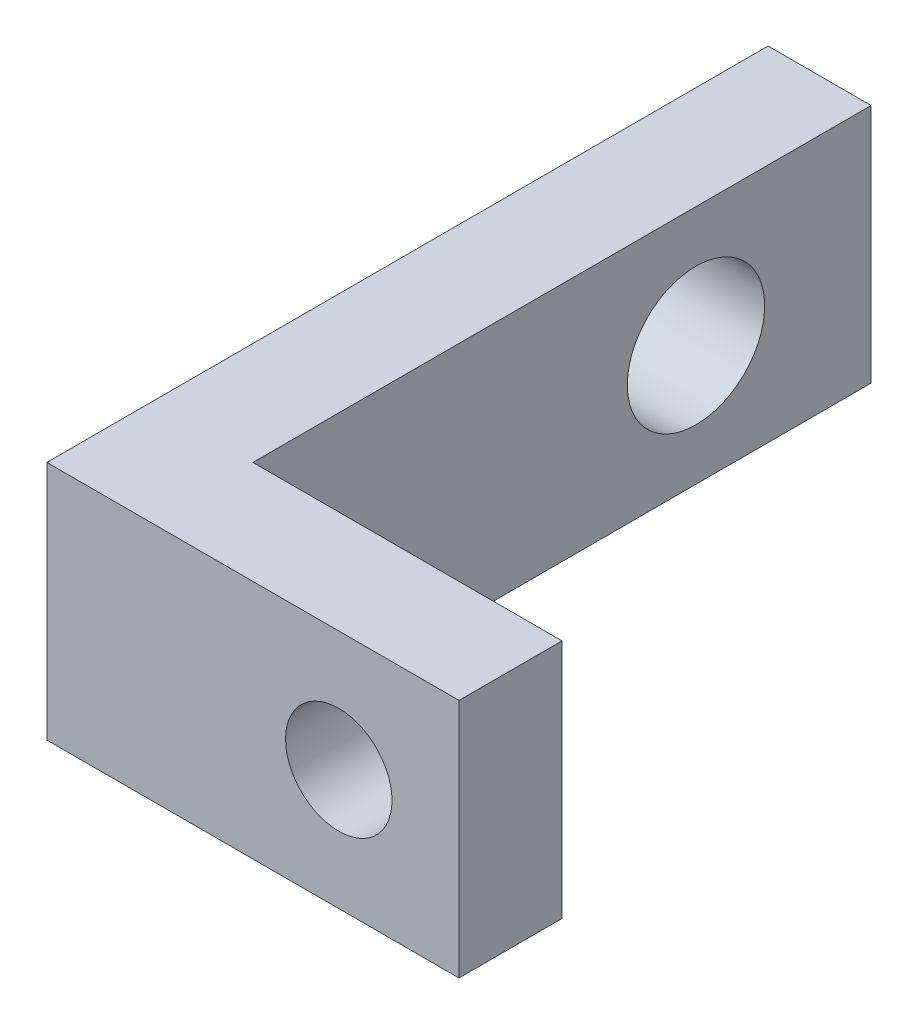
ISO-10303-21;
HEADER;
FILE_DESCRIPTION(('STEP AP214'),'2;1');
FILE_NAME('part.step','',(''),(''),'','','');
FILE_SCHEMA(('AUTOMOTIVE_DESIGN { 1 0 10303 214 1 1 1 1 }'));
ENDSEC;
DATA;
#1=APPLICATION_CONTEXT('core data for automotive mechanical design processes');
#2=APPLICATION_PROTOCOL_DEFINITION('international standard','automotive_design',2000,#1);
#3=PRODUCT_CONTEXT('',#1,'mechanical');
#4=PRODUCT('Part','Part','',(#3));
#5=PRODUCT_RELATED_PRODUCT_CATEGORY('part','',(#4));
#6=PRODUCT_DEFINITION_FORMATION('','',#4);
#7=PRODUCT_DEFINITION_CONTEXT('part definition',#1,'design');
#8=PRODUCT_DEFINITION('design','',#6,#7);
#9=PRODUCT_DEFINITION_SHAPE('','',#8);
#10=(LENGTH_UNIT() NAMED_UNIT(*) SI_UNIT(.MILLI.,.METRE.));
#11=(NAMED_UNIT(*) PLANE_ANGLE_UNIT() SI_UNIT($,.RADIAN.));
#12=(NAMED_UNIT(*) SI_UNIT($,.STERADIAN.) SOLID_ANGLE_UNIT());
#13=UNCERTAINTY_MEASURE_WITH_UNIT(LENGTH_MEASURE(1.E-05),#10,'distance_accuracy_value','');
#14=(GEOMETRIC_REPRESENTATION_CONTEXT(3) GLOBAL_UNCERTAINTY_ASSIGNED_CONTEXT((#13)) GLOBAL_UNIT_ASSIGNED_CONTEXT((#10,
#11,#12)) REPRESENTATION_CONTEXT('',''));
#15=CARTESIAN_POINT('',(0.,0.,0.));
#16=DIRECTION('',(0.,0.,1.));
#17=DIRECTION('',(1.,0.,0.));
#18=AXIS2_PLACEMENT_3D('',#15,#16,#17);
#19=CARTESIAN_POINT('',(-15.85,35.9672502122994,-9.9));
#20=DIRECTION('',(-1.,0.,0.));
#21=DIRECTION('',(0.,0.,1.));
#22=AXIS2_PLACEMENT_3D('',#19,#20,#21);
#23=CYLINDRICAL_SURFACE('',#22,2.);
#24=CARTESIAN_POINT('',(-30.85,35.9672502122994,-9.9));
#25=DIRECTION('',(-1.,0.,0.));
#26=DIRECTION('',(0.,0.,1.));
#27=AXIS2_PLACEMENT_3D('',#24,#25,#26);
#28=CIRCLE('',#27,2.);
#29=CARTESIAN_POINT('',(-30.85,35.9672502122994,-7.9));
#30=VERTEX_POINT('',#29);
#31=EDGE_CURVE('E122',#30,#30,#28,.T.);
#32=ORIENTED_EDGE('',*,*,#31,.T.);
#33=EDGE_LOOP('',(#32));
#34=FACE_BOUND('',#33,.T.);
#35=CARTESIAN_POINT('',(-27.85,35.9672502122994,-9.9));
#36=DIRECTION('',(-1.,0.,0.));
#37=DIRECTION('',(0.,0.,1.));
#38=AXIS2_PLACEMENT_3D('',#35,#36,#37);
#39=CIRCLE('',#38,2.);
#40=CARTESIAN_POINT('',(-27.85,35.9672502122994,-7.9));
#41=VERTEX_POINT('',#40);
#42=EDGE_CURVE('E125',#41,#41,#39,.T.);
#43=ORIENTED_EDGE('',*,*,#42,.F.);
#44=EDGE_LOOP('',(#43));
#45=FACE_BOUND('',#44,.T.);
#46=ADVANCED_FACE('F33',(#34,#45),#23,.F.);
#47=CARTESIAN_POINT('',(-27.85,39.4672502122995,-15.));
#48=DIRECTION('',(-1.,0.,0.));
#49=DIRECTION('',(0.,0.,1.));
#50=AXIS2_PLACEMENT_3D('',#47,#48,#49);
#51=PLANE('',#50);
#52=ORIENTED_EDGE('',*,*,#42,.T.);
#53=EDGE_LOOP('',(#52));
#54=FACE_BOUND('',#53,.T.);
#55=DIRECTION('',(0.,0.,1.));
#56=VECTOR('',#55,1.);
#57=CARTESIAN_POINT('',(-27.85,39.4672502122995,-15.));
#58=LINE('',#57,#56);
#59=CARTESIAN_POINT('',(-27.85,39.4672502122995,-15.));
#60=VERTEX_POINT('',#59);
#61=CARTESIAN_POINT('',(-27.85,39.4672502122995,3.));
#62=VERTEX_POINT('',#61);
#63=EDGE_CURVE('E128',#60,#62,#58,.T.);
#64=ORIENTED_EDGE('',*,*,#63,.T.);
#65=DIRECTION('',(0.,-1.,0.));
#66=VECTOR('',#65,1.);
#67=CARTESIAN_POINT('',(-27.85,101.467250212299,3.));
#68=LINE('',#67,#66);
#69=CARTESIAN_POINT('',(-27.85,32.4672502122995,3.));
#70=VERTEX_POINT('',#69);
#71=EDGE_CURVE('E107',#62,#70,#68,.T.);
#72=ORIENTED_EDGE('',*,*,#71,.T.);
#73=DIRECTION('',(0.,0.,1.));
#74=VECTOR('',#73,1.);
#75=CARTESIAN_POINT('',(-27.85,32.4672502122995,-15.));
#76=LINE('',#75,#74);
#77=CARTESIAN_POINT('',(-27.85,32.4672502122995,-15.));
#78=VERTEX_POINT('',#77);
#79=EDGE_CURVE('E105',#78,#70,#76,.T.);
#80=ORIENTED_EDGE('',*,*,#79,.F.);
#81=DIRECTION('',(0.,-1.,0.));
#82=VECTOR('',#81,1.);
#83=CARTESIAN_POINT('',(-27.85,39.4672502122995,-15.));
#84=LINE('',#83,#82);
#85=EDGE_CURVE('E130',#60,#78,#84,.T.);
#86=ORIENTED_EDGE('',*,*,#85,.F.);
#87=EDGE_LOOP('',(#64,#72,#80,#86));
#88=FACE_BOUND('',#87,.T.);
#89=ADVANCED_FACE('F162',(#54,#88),#51,.F.);
#90=CARTESIAN_POINT('',(0.,0.,-15.));
#91=DIRECTION('',(0.,0.,-1.));
#92=DIRECTION('',(-1.,0.,0.));
#93=AXIS2_PLACEMENT_3D('',#90,#91,#92);
#94=PLANE('',#93);
#95=DIRECTION('',(0.,1.,0.));
#96=VECTOR('',#95,1.);
#97=CARTESIAN_POINT('',(-30.85,39.4672502122995,-15.));
#98=LINE('',#97,#96);
#99=CARTESIAN_POINT('',(-30.85,32.4672502122995,-15.));
#100=VERTEX_POINT('',#99);
#101=CARTESIAN_POINT('',(-30.85,39.4672502122995,-15.));
#102=VERTEX_POINT('',#101);
#103=EDGE_CURVE('E126',#100,#102,#98,.T.);
#104=ORIENTED_EDGE('',*,*,#103,.T.);
#105=DIRECTION('',(1.,0.,0.));
#106=VECTOR('',#105,1.);
#107=CARTESIAN_POINT('',(-27.85,39.4672502122995,-15.));
#108=LINE('',#107,#106);
#109=EDGE_CURVE('E78',#102,#60,#108,.T.);
#110=ORIENTED_EDGE('',*,*,#109,.T.);
#111=ORIENTED_EDGE('',*,*,#85,.T.);
#112=DIRECTION('',(-1.,0.,0.));
#113=VECTOR('',#112,1.);
#114=CARTESIAN_POINT('',(-27.85,32.4672502122995,-15.));
#115=LINE('',#114,#113);
#116=EDGE_CURVE('E132',#78,#100,#115,.T.);
#117=ORIENTED_EDGE('',*,*,#116,.T.);
#118=EDGE_LOOP('',(#104,#110,#111,#117));
#119=FACE_BOUND('',#118,.T.);
#120=ADVANCED_FACE('F168',(#119),#94,.T.);
#121=CARTESIAN_POINT('',(-27.85,32.4672502122995,-15.));
#122=DIRECTION('',(0.,1.,0.));
#123=DIRECTION('',(0.,0.,1.));
#124=AXIS2_PLACEMENT_3D('',#121,#122,#123);
#125=PLANE('',#124);
#126=ORIENTED_EDGE('',*,*,#79,.T.);
#127=DIRECTION('',(-1.,0.,0.));
#128=VECTOR('',#127,1.);
#129=CARTESIAN_POINT('',(-27.85,32.4672502122995,3.));
#130=LINE('',#129,#128);
#131=CARTESIAN_POINT('',(-18.85,32.4672502122995,3.));
#132=VERTEX_POINT('',#131);
#133=EDGE_CURVE('E98',#132,#70,#130,.T.);
#134=ORIENTED_EDGE('',*,*,#133,.F.);
#135=DIRECTION('',(0.,0.,-1.));
#136=VECTOR('',#135,1.);
#137=CARTESIAN_POINT('',(-18.85,32.4672502122995,69.));
#138=LINE('',#137,#136);
#139=CARTESIAN_POINT('',(-18.85,32.4672502122995,6.00000000000001));
#140=VERTEX_POINT('',#139);
#141=EDGE_CURVE('E41',#140,#132,#138,.T.);
#142=ORIENTED_EDGE('',*,*,#141,.F.);
#143=DIRECTION('',(-1.,0.,0.));
#144=VECTOR('',#143,1.);
#145=CARTESIAN_POINT('',(0.,32.4672502122995,6.));
#146=LINE('',#145,#144);
#147=CARTESIAN_POINT('',(-30.85,32.4672502122995,6.00000000000001));
#148=VERTEX_POINT('',#147);
#149=EDGE_CURVE('E114',#140,#148,#146,.T.);
#150=ORIENTED_EDGE('',*,*,#149,.T.);
#151=DIRECTION('',(0.,0.,1.));
#152=VECTOR('',#151,1.);
#153=CARTESIAN_POINT('',(-30.85,32.4672502122995,-15.));
#154=LINE('',#153,#152);
#155=EDGE_CURVE('E70',#100,#148,#154,.T.);
#156=ORIENTED_EDGE('',*,*,#155,.F.);
#157=ORIENTED_EDGE('',*,*,#116,.F.);
#158=EDGE_LOOP('',(#126,#134,#142,#150,#156,#157));
#159=FACE_BOUND('',#158,.T.);
#160=ADVANCED_FACE('F101',(#159),#125,.F.);
#161=CARTESIAN_POINT('',(-27.85,39.4672502122995,-15.));
#162=DIRECTION('',(0.,-1.,0.));
#163=DIRECTION('',(0.,0.,-1.));
#164=AXIS2_PLACEMENT_3D('',#161,#162,#163);
#165=PLANE('',#164);
#166=DIRECTION('',(-1.,0.,0.));
#167=VECTOR('',#166,1.);
#168=CARTESIAN_POINT('',(-27.85,39.4672502122995,3.));
#169=LINE('',#168,#167);
#170=CARTESIAN_POINT('',(-18.85,39.4672502122995,3.));
#171=VERTEX_POINT('',#170);
#172=EDGE_CURVE('E48',#171,#62,#169,.T.);
#173=ORIENTED_EDGE('',*,*,#172,.T.);
#174=ORIENTED_EDGE('',*,*,#63,.F.);
#175=ORIENTED_EDGE('',*,*,#109,.F.);
#176=DIRECTION('',(0.,0.,1.));
#177=VECTOR('',#176,1.);
#178=CARTESIAN_POINT('',(-30.85,39.4672502122995,-15.));
#179=LINE('',#178,#177);
#180=CARTESIAN_POINT('',(-30.85,39.4672502122995,6.00000000000001));
#181=VERTEX_POINT('',#180);
#182=EDGE_CURVE('E135',#102,#181,#179,.T.);
#183=ORIENTED_EDGE('',*,*,#182,.T.);
#184=DIRECTION('',(1.,0.,0.));
#185=VECTOR('',#184,1.);
#186=CARTESIAN_POINT('',(0.,39.4672502122995,6.));
#187=LINE('',#186,#185);
#188=CARTESIAN_POINT('',(-18.85,39.4672502122995,6.00000000000001));
#189=VERTEX_POINT('',#188);
#190=EDGE_CURVE('E116',#181,#189,#187,.T.);
#191=ORIENTED_EDGE('',*,*,#190,.T.);
#192=DIRECTION('',(0.,0.,-1.));
#193=VECTOR('',#192,1.);
#194=CARTESIAN_POINT('',(-18.85,39.4672502122995,69.));
#195=LINE('',#194,#193);
#196=EDGE_CURVE('E111',#189,#171,#195,.T.);
#197=ORIENTED_EDGE('',*,*,#196,.T.);
#198=EDGE_LOOP('',(#173,#174,#175,#183,#191,#197));
#199=FACE_BOUND('',#198,.T.);
#200=ADVANCED_FACE('F176',(#199),#165,.F.);
#201=CARTESIAN_POINT('',(-30.85,39.4672502122995,-15.));
#202=DIRECTION('',(1.,0.,0.));
#203=DIRECTION('',(0.,0.,-1.));
#204=AXIS2_PLACEMENT_3D('',#201,#202,#203);
#205=PLANE('',#204);
#206=ORIENTED_EDGE('',*,*,#31,.F.);
#207=EDGE_LOOP('',(#206));
#208=FACE_BOUND('',#207,.T.);
#209=DIRECTION('',(0.,-1.,0.));
#210=VECTOR('',#209,1.);
#211=CARTESIAN_POINT('',(-30.85,0.,6.));
#212=LINE('',#211,#210);
#213=EDGE_CURVE('E118',#181,#148,#212,.T.);
#214=ORIENTED_EDGE('',*,*,#213,.F.);
#215=ORIENTED_EDGE('',*,*,#182,.F.);
#216=ORIENTED_EDGE('',*,*,#103,.F.);
#217=ORIENTED_EDGE('',*,*,#155,.T.);
#218=EDGE_LOOP('',(#214,#215,#216,#217));
#219=FACE_BOUND('',#218,.T.);
#220=ADVANCED_FACE('F180',(#208,#219),#205,.F.);
#221=CARTESIAN_POINT('',(0.,0.,6.));
#222=DIRECTION('',(0.,0.,1.));
#223=DIRECTION('',(1.,0.,0.));
#224=AXIS2_PLACEMENT_3D('',#221,#222,#223);
#225=PLANE('',#224);
#226=CARTESIAN_POINT('',(-22.35,35.9672502122994,6.00000000000001));
#227=DIRECTION('',(0.,0.,1.));
#228=DIRECTION('',(1.,0.,0.));
#229=AXIS2_PLACEMENT_3D('',#226,#227,#228);
#230=CIRCLE('',#229,1.55);
#231=CARTESIAN_POINT('',(-20.8,35.9672502122994,6.00000000000001));
#232=VERTEX_POINT('',#231);
#233=EDGE_CURVE('E108',#232,#232,#230,.T.);
#234=ORIENTED_EDGE('',*,*,#233,.F.);
#235=EDGE_LOOP('',(#234));
#236=FACE_BOUND('',#235,.T.);
#237=ORIENTED_EDGE('',*,*,#190,.F.);
#238=ORIENTED_EDGE('',*,*,#213,.T.);
#239=ORIENTED_EDGE('',*,*,#149,.F.);
#240=DIRECTION('',(0.,-1.,0.));
#241=VECTOR('',#240,1.);
#242=CARTESIAN_POINT('',(-18.85,0.,6.));
#243=LINE('',#242,#241);
#244=EDGE_CURVE('E56',#189,#140,#243,.T.);
#245=ORIENTED_EDGE('',*,*,#244,.F.);
#246=EDGE_LOOP('',(#237,#238,#239,#245));
#247=FACE_BOUND('',#246,.T.);
#248=ADVANCED_FACE('F159',(#236,#247),#225,.T.);
#249=CARTESIAN_POINT('',(-18.85,39.4672502122995,69.));
#250=DIRECTION('',(-1.,0.,0.));
#251=DIRECTION('',(0.,0.,1.));
#252=AXIS2_PLACEMENT_3D('',#249,#250,#251);
#253=PLANE('',#252);
#254=ORIENTED_EDGE('',*,*,#141,.T.);
#255=DIRECTION('',(0.,1.,0.));
#256=VECTOR('',#255,1.);
#257=CARTESIAN_POINT('',(-18.85,39.4672502122995,3.));
#258=LINE('',#257,#256);
#259=EDGE_CURVE('E11',#132,#171,#258,.T.);
#260=ORIENTED_EDGE('',*,*,#259,.T.);
#261=ORIENTED_EDGE('',*,*,#196,.F.);
#262=ORIENTED_EDGE('',*,*,#244,.T.);
#263=EDGE_LOOP('',(#254,#260,#261,#262));
#264=FACE_BOUND('',#263,.T.);
#265=ADVANCED_FACE('F35',(#264),#253,.F.);
#266=CARTESIAN_POINT('',(-27.85,101.467250212299,3.));
#267=DIRECTION('',(0.,0.,1.));
#268=DIRECTION('',(1.,0.,0.));
#269=AXIS2_PLACEMENT_3D('',#266,#267,#268);
#270=PLANE('',#269);
#271=CARTESIAN_POINT('',(-22.35,35.9672502122994,3.));
#272=DIRECTION('',(0.,0.,-1.));
#273=DIRECTION('',(-1.,0.,0.));
#274=AXIS2_PLACEMENT_3D('',#271,#272,#273);
#275=CIRCLE('',#274,1.55);
#276=CARTESIAN_POINT('',(-23.9,35.9672502122994,3.));
#277=VERTEX_POINT('',#276);
#278=EDGE_CURVE('E145',#277,#277,#275,.T.);
#279=ORIENTED_EDGE('',*,*,#278,.F.);
#280=EDGE_LOOP('',(#279));
#281=FACE_BOUND('',#280,.T.);
#282=ORIENTED_EDGE('',*,*,#259,.F.);
#283=ORIENTED_EDGE('',*,*,#133,.T.);
#284=ORIENTED_EDGE('',*,*,#71,.F.);
#285=ORIENTED_EDGE('',*,*,#172,.F.);
#286=EDGE_LOOP('',(#282,#283,#284,#285));
#287=FACE_BOUND('',#286,.T.);
#288=ADVANCED_FACE('F97',(#281,#287),#270,.F.);
#289=CARTESIAN_POINT('',(-22.35,35.9672502122994,72.));
#290=DIRECTION('',(0.,0.,-1.));
#291=DIRECTION('',(-1.,0.,0.));
#292=AXIS2_PLACEMENT_3D('',#289,#290,#291);
#293=CYLINDRICAL_SURFACE('',#292,1.55);
#294=ORIENTED_EDGE('',*,*,#233,.T.);
#295=EDGE_LOOP('',(#294));
#296=FACE_BOUND('',#295,.T.);
#297=ORIENTED_EDGE('',*,*,#278,.T.);
#298=EDGE_LOOP('',(#297));
#299=FACE_BOUND('',#298,.T.);
#300=ADVANCED_FACE('F149',(#296,#299),#293,.F.);
#301=CLOSED_SHELL('',(#46,#89,#120,#160,#200,#220,#248,#265,#288,#300));
#302=MANIFOLD_SOLID_BREP('B2',#301);
#303=ADVANCED_BREP_SHAPE_REPRESENTATION('',(#18,#302),#14);
#304=SHAPE_DEFINITION_REPRESENTATION(#9,#303);
ENDSEC;
END-ISO-10303-21;
